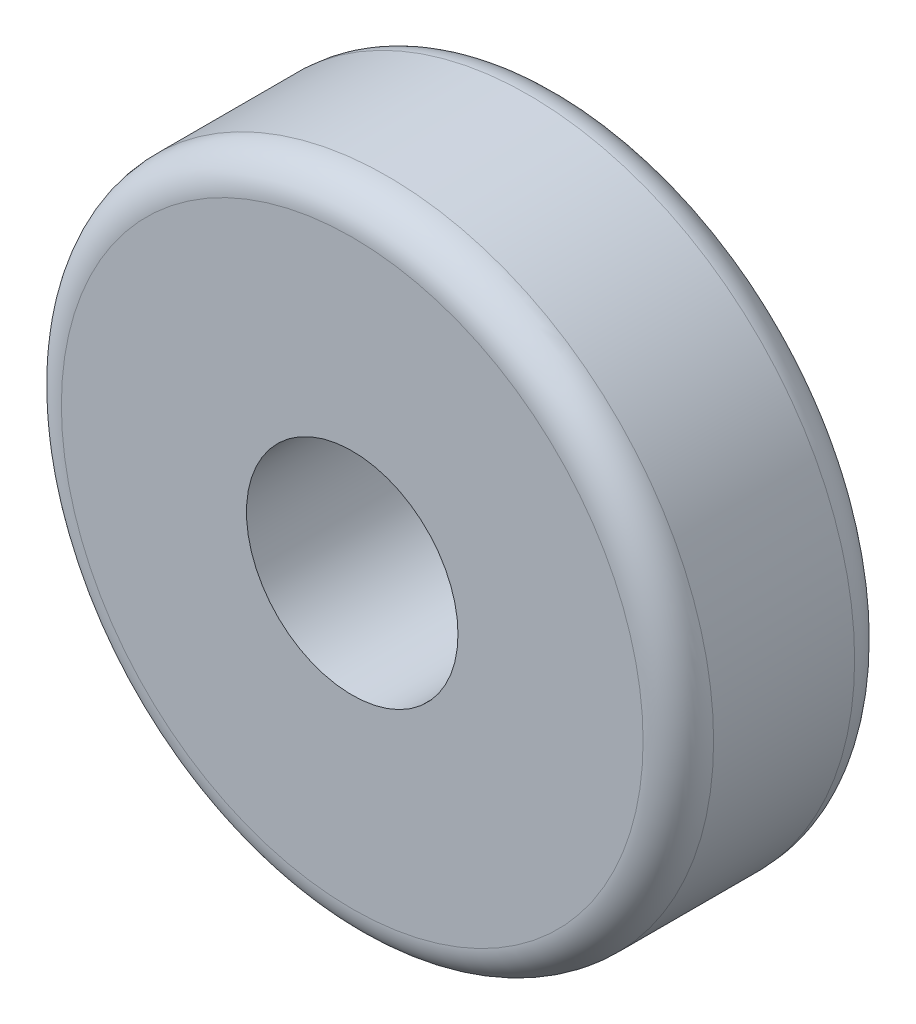
ISO-10303-21;
HEADER;
FILE_DESCRIPTION(('STEP AP214'),'2;1');
FILE_NAME('part.step','',(''),(''),'','','');
FILE_SCHEMA(('AUTOMOTIVE_DESIGN { 1 0 10303 214 1 1 1 1 }'));
ENDSEC;
DATA;
#1=APPLICATION_CONTEXT('core data for automotive mechanical design processes');
#2=APPLICATION_PROTOCOL_DEFINITION('international standard','automotive_design',2000,#1);
#3=PRODUCT_CONTEXT('',#1,'mechanical');
#4=PRODUCT('Part','Part','',(#3));
#5=PRODUCT_RELATED_PRODUCT_CATEGORY('part','',(#4));
#6=PRODUCT_DEFINITION_FORMATION('','',#4);
#7=PRODUCT_DEFINITION_CONTEXT('part definition',#1,'design');
#8=PRODUCT_DEFINITION('design','',#6,#7);
#9=PRODUCT_DEFINITION_SHAPE('','',#8);
#10=(LENGTH_UNIT() NAMED_UNIT(*) SI_UNIT(.MILLI.,.METRE.));
#11=(NAMED_UNIT(*) PLANE_ANGLE_UNIT() SI_UNIT($,.RADIAN.));
#12=(NAMED_UNIT(*) SI_UNIT($,.STERADIAN.) SOLID_ANGLE_UNIT());
#13=UNCERTAINTY_MEASURE_WITH_UNIT(LENGTH_MEASURE(1.E-05),#10,'distance_accuracy_value','');
#14=(GEOMETRIC_REPRESENTATION_CONTEXT(3) GLOBAL_UNCERTAINTY_ASSIGNED_CONTEXT((#13)) GLOBAL_UNIT_ASSIGNED_CONTEXT((#10,
#11,#12)) REPRESENTATION_CONTEXT('',''));
#15=CARTESIAN_POINT('',(0.,0.,0.));
#16=DIRECTION('',(0.,0.,1.));
#17=DIRECTION('',(1.,0.,0.));
#18=AXIS2_PLACEMENT_3D('',#15,#16,#17);
#19=CARTESIAN_POINT('',(0.,0.,12.));
#20=DIRECTION('',(0.,0.,1.));
#21=DIRECTION('',(1.,0.,0.));
#22=AXIS2_PLACEMENT_3D('',#19,#20,#21);
#23=PLANE('',#22);
#24=CARTESIAN_POINT('',(0.,0.,12.));
#25=DIRECTION('',(0.,0.,1.));
#26=DIRECTION('',(1.,0.,0.));
#27=AXIS2_PLACEMENT_3D('',#24,#25,#26);
#28=CIRCLE('',#27,16.5);
#29=CARTESIAN_POINT('',(16.5,0.,12.));
#30=VERTEX_POINT('',#29);
#31=EDGE_CURVE('E46',#30,#30,#28,.T.);
#32=ORIENTED_EDGE('',*,*,#31,.T.);
#33=EDGE_LOOP('',(#32));
#34=FACE_BOUND('',#33,.T.);
#35=CARTESIAN_POINT('',(0.,0.,12.));
#36=DIRECTION('',(0.,0.,1.));
#37=DIRECTION('',(1.,0.,0.));
#38=AXIS2_PLACEMENT_3D('',#35,#36,#37);
#39=CIRCLE('',#38,6.);
#40=CARTESIAN_POINT('',(6.,0.,12.));
#41=VERTEX_POINT('',#40);
#42=EDGE_CURVE('E51',#41,#41,#39,.T.);
#43=ORIENTED_EDGE('',*,*,#42,.F.);
#44=EDGE_LOOP('',(#43));
#45=FACE_BOUND('',#44,.T.);
#46=ADVANCED_FACE('F31',(#34,#45),#23,.T.);
#47=CARTESIAN_POINT('',(0.,0.,0.));
#48=DIRECTION('',(0.,0.,1.));
#49=DIRECTION('',(1.,0.,0.));
#50=AXIS2_PLACEMENT_3D('',#47,#48,#49);
#51=PLANE('',#50);
#52=CARTESIAN_POINT('',(0.,0.,0.));
#53=DIRECTION('',(0.,0.,1.));
#54=DIRECTION('',(1.,0.,0.));
#55=AXIS2_PLACEMENT_3D('',#52,#53,#54);
#56=CIRCLE('',#55,16.5);
#57=CARTESIAN_POINT('',(16.5,0.,0.));
#58=VERTEX_POINT('',#57);
#59=EDGE_CURVE('E10',#58,#58,#56,.F.);
#60=ORIENTED_EDGE('',*,*,#59,.T.);
#61=EDGE_LOOP('',(#60));
#62=FACE_BOUND('',#61,.T.);
#63=CARTESIAN_POINT('',(0.,0.,0.));
#64=DIRECTION('',(0.,0.,1.));
#65=DIRECTION('',(1.,0.,0.));
#66=AXIS2_PLACEMENT_3D('',#63,#64,#65);
#67=CIRCLE('',#66,6.);
#68=CARTESIAN_POINT('',(6.,0.,0.));
#69=VERTEX_POINT('',#68);
#70=EDGE_CURVE('E54',#69,#69,#67,.T.);
#71=ORIENTED_EDGE('',*,*,#70,.T.);
#72=EDGE_LOOP('',(#71));
#73=FACE_BOUND('',#72,.T.);
#74=ADVANCED_FACE('F58',(#62,#73),#51,.F.);
#75=CARTESIAN_POINT('',(0.,0.,12.));
#76=DIRECTION('',(0.,0.,-1.));
#77=DIRECTION('',(-1.,0.,0.));
#78=AXIS2_PLACEMENT_3D('',#75,#76,#77);
#79=CYLINDRICAL_SURFACE('',#78,18.5);
#80=CARTESIAN_POINT('',(0.,0.,2.));
#81=DIRECTION('',(0.,0.,1.));
#82=DIRECTION('',(1.,0.,0.));
#83=AXIS2_PLACEMENT_3D('',#80,#81,#82);
#84=CIRCLE('',#83,18.5);
#85=CARTESIAN_POINT('',(18.5,0.,2.));
#86=VERTEX_POINT('',#85);
#87=EDGE_CURVE('E38',#86,#86,#84,.T.);
#88=ORIENTED_EDGE('',*,*,#87,.T.);
#89=EDGE_LOOP('',(#88));
#90=FACE_BOUND('',#89,.T.);
#91=CARTESIAN_POINT('',(0.,0.,10.));
#92=DIRECTION('',(0.,0.,1.));
#93=DIRECTION('',(1.,0.,0.));
#94=AXIS2_PLACEMENT_3D('',#91,#92,#93);
#95=CIRCLE('',#94,18.5);
#96=CARTESIAN_POINT('',(18.5,0.,10.));
#97=VERTEX_POINT('',#96);
#98=EDGE_CURVE('E42',#97,#97,#95,.F.);
#99=ORIENTED_EDGE('',*,*,#98,.T.);
#100=EDGE_LOOP('',(#99));
#101=FACE_BOUND('',#100,.T.);
#102=ADVANCED_FACE('F33',(#90,#101),#79,.T.);
#103=CARTESIAN_POINT('',(0.,0.,12.));
#104=DIRECTION('',(0.,0.,-1.));
#105=DIRECTION('',(-1.,0.,0.));
#106=AXIS2_PLACEMENT_3D('',#103,#104,#105);
#107=CYLINDRICAL_SURFACE('',#106,6.);
#108=ORIENTED_EDGE('',*,*,#42,.T.);
#109=EDGE_LOOP('',(#108));
#110=FACE_BOUND('',#109,.T.);
#111=ORIENTED_EDGE('',*,*,#70,.F.);
#112=EDGE_LOOP('',(#111));
#113=FACE_BOUND('',#112,.T.);
#114=ADVANCED_FACE('F60',(#110,#113),#107,.F.);
#115=CARTESIAN_POINT('',(0.,0.,10.));
#116=DIRECTION('',(0.,0.,1.));
#117=DIRECTION('',(1.,0.,0.));
#118=AXIS2_PLACEMENT_3D('',#115,#116,#117);
#119=TOROIDAL_SURFACE('',#118,16.5,2.);
#120=ORIENTED_EDGE('',*,*,#98,.F.);
#121=EDGE_LOOP('',(#120));
#122=FACE_BOUND('',#121,.T.);
#123=ORIENTED_EDGE('',*,*,#31,.F.);
#124=EDGE_LOOP('',(#123));
#125=FACE_BOUND('',#124,.T.);
#126=ADVANCED_FACE('F62',(#122,#125),#119,.T.);
#127=CARTESIAN_POINT('',(0.,0.,2.));
#128=DIRECTION('',(0.,0.,1.));
#129=DIRECTION('',(1.,0.,0.));
#130=AXIS2_PLACEMENT_3D('',#127,#128,#129);
#131=TOROIDAL_SURFACE('',#130,16.5,2.);
#132=ORIENTED_EDGE('',*,*,#59,.F.);
#133=EDGE_LOOP('',(#132));
#134=FACE_BOUND('',#133,.T.);
#135=ORIENTED_EDGE('',*,*,#87,.F.);
#136=EDGE_LOOP('',(#135));
#137=FACE_BOUND('',#136,.T.);
#138=ADVANCED_FACE('F69',(#134,#137),#131,.T.);
#139=CLOSED_SHELL('',(#46,#74,#102,#114,#126,#138));
#140=MANIFOLD_SOLID_BREP('B2',#139);
#141=ADVANCED_BREP_SHAPE_REPRESENTATION('',(#18,#140),#14);
#142=SHAPE_DEFINITION_REPRESENTATION(#9,#141);
ENDSEC;
END-ISO-10303-21;
